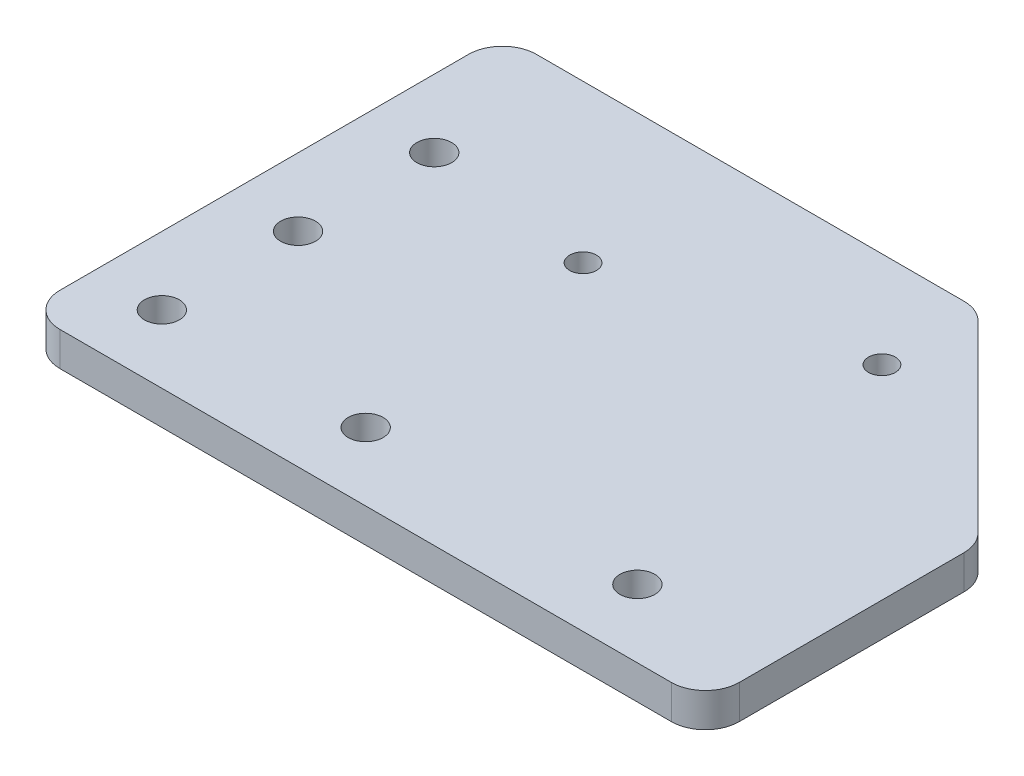
ISO-10303-21;
HEADER;
FILE_DESCRIPTION(('STEP AP214'),'2;1');
FILE_NAME('part.step','',(''),(''),'','','');
FILE_SCHEMA(('AUTOMOTIVE_DESIGN { 1 0 10303 214 1 1 1 1 }'));
ENDSEC;
DATA;
#1=APPLICATION_CONTEXT('core data for automotive mechanical design processes');
#2=APPLICATION_PROTOCOL_DEFINITION('international standard','automotive_design',2000,#1);
#3=PRODUCT_CONTEXT('',#1,'mechanical');
#4=PRODUCT('Part','Part','',(#3));
#5=PRODUCT_RELATED_PRODUCT_CATEGORY('part','',(#4));
#6=PRODUCT_DEFINITION_FORMATION('','',#4);
#7=PRODUCT_DEFINITION_CONTEXT('part definition',#1,'design');
#8=PRODUCT_DEFINITION('design','',#6,#7);
#9=PRODUCT_DEFINITION_SHAPE('','',#8);
#10=(LENGTH_UNIT() NAMED_UNIT(*) SI_UNIT(.MILLI.,.METRE.));
#11=(NAMED_UNIT(*) PLANE_ANGLE_UNIT() SI_UNIT($,.RADIAN.));
#12=(NAMED_UNIT(*) SI_UNIT($,.STERADIAN.) SOLID_ANGLE_UNIT());
#13=UNCERTAINTY_MEASURE_WITH_UNIT(LENGTH_MEASURE(1.E-05),#10,'distance_accuracy_value','');
#14=(GEOMETRIC_REPRESENTATION_CONTEXT(3) GLOBAL_UNCERTAINTY_ASSIGNED_CONTEXT((#13)) GLOBAL_UNIT_ASSIGNED_CONTEXT((#10,
#11,#12)) REPRESENTATION_CONTEXT('',''));
#15=CARTESIAN_POINT('',(0.,0.,0.));
#16=DIRECTION('',(0.,0.,1.));
#17=DIRECTION('',(1.,0.,0.));
#18=AXIS2_PLACEMENT_3D('',#15,#16,#17);
#19=CARTESIAN_POINT('',(-838.109743878933,19.0500000000059,838.109743878928));
#20=DIRECTION('',(0.707106781186549,0.,-0.707106781186545));
#21=DIRECTION('',(-0.707106781186545,0.,-0.70710678118655));
#22=AXIS2_PLACEMENT_3D('',#19,#20,#21);
#23=PLANE('',#22);
#24=DIRECTION('',(0.707106781186545,0.,0.70710678118655));
#25=VECTOR('',#24,1.);
#26=CARTESIAN_POINT('',(-838.109743878933,19.0500000000059,838.109743878928));
#27=LINE('',#26,#25);
#28=CARTESIAN_POINT('',(-836.340128060535,19.0500000000058,839.879359697327));
#29=VERTEX_POINT('',#28);
#30=CARTESIAN_POINT('',(-801.959718921586,19.0500000000056,874.259768836275));
#31=VERTEX_POINT('',#30);
#32=EDGE_CURVE('E222',#29,#31,#27,.T.);
#33=ORIENTED_EDGE('',*,*,#32,.T.);
#34=DIRECTION('',(0.,-1.,0.));
#35=VECTOR('',#34,1.);
#36=CARTESIAN_POINT('',(-801.959718921586,19.0500000000056,874.259768836275));
#37=LINE('',#36,#35);
#38=CARTESIAN_POINT('',(-801.959718921586,12.7000000000056,874.259768836275));
#39=VERTEX_POINT('',#38);
#40=EDGE_CURVE('E172',#31,#39,#37,.T.);
#41=ORIENTED_EDGE('',*,*,#40,.T.);
#42=DIRECTION('',(0.707106781186545,0.,0.70710678118655));
#43=VECTOR('',#42,1.);
#44=CARTESIAN_POINT('',(-838.109743878933,12.7000000000059,838.109743878928));
#45=LINE('',#44,#43);
#46=CARTESIAN_POINT('',(-836.340128060535,12.7000000000058,839.879359697327));
#47=VERTEX_POINT('',#46);
#48=EDGE_CURVE('E121',#47,#39,#45,.T.);
#49=ORIENTED_EDGE('',*,*,#48,.F.);
#50=DIRECTION('',(0.,-1.,0.));
#51=VECTOR('',#50,1.);
#52=CARTESIAN_POINT('',(-836.340128060535,19.0500000000058,839.879359697327));
#53=LINE('',#52,#51);
#54=EDGE_CURVE('E170',#47,#29,#53,.F.);
#55=ORIENTED_EDGE('',*,*,#54,.T.);
#56=EDGE_LOOP('',(#33,#41,#49,#55));
#57=FACE_BOUND('',#56,.T.);
#58=ADVANCED_FACE('F36',(#57),#23,.T.);
#59=CARTESIAN_POINT('',(1.11022302462516E-13,19.05,838.019487757861));
#60=DIRECTION('',(0.,0.,1.));
#61=DIRECTION('',(1.,0.,0.));
#62=AXIS2_PLACEMENT_3D('',#59,#60,#61);
#63=PLANE('',#62);
#64=DIRECTION('',(-1.,0.,0.));
#65=VECTOR('',#64,1.);
#66=CARTESIAN_POINT('',(1.11022302462516E-13,19.05,838.019487757861));
#67=LINE('',#66,#65);
#68=CARTESIAN_POINT('',(-840.830256121069,19.0500000000059,838.019487757861));
#69=VERTEX_POINT('',#68);
#70=CARTESIAN_POINT('',(-920.749846982121,19.0500000000064,838.019487757861));
#71=VERTEX_POINT('',#70);
#72=EDGE_CURVE('E142',#69,#71,#67,.T.);
#73=ORIENTED_EDGE('',*,*,#72,.F.);
#74=DIRECTION('',(0.,-1.,0.));
#75=VECTOR('',#74,1.);
#76=CARTESIAN_POINT('',(-840.830256121069,12.7000000000059,838.019487757861));
#77=LINE('',#76,#75);
#78=CARTESIAN_POINT('',(-840.830256121069,12.7000000000059,838.019487757861));
#79=VERTEX_POINT('',#78);
#80=EDGE_CURVE('E176',#69,#79,#77,.T.);
#81=ORIENTED_EDGE('',*,*,#80,.T.);
#82=DIRECTION('',(-1.,0.,0.));
#83=VECTOR('',#82,1.);
#84=CARTESIAN_POINT('',(1.11022302462516E-13,12.7,838.019487757861));
#85=LINE('',#84,#83);
#86=CARTESIAN_POINT('',(-920.749846982121,12.7000000000064,838.019487757861));
#87=VERTEX_POINT('',#86);
#88=EDGE_CURVE('E149',#79,#87,#85,.T.);
#89=ORIENTED_EDGE('',*,*,#88,.T.);
#90=DIRECTION('',(0.,-1.,0.));
#91=VECTOR('',#90,1.);
#92=CARTESIAN_POINT('',(-920.749846982121,19.0500000000064,838.019487757861));
#93=LINE('',#92,#91);
#94=EDGE_CURVE('E174',#87,#71,#93,.F.);
#95=ORIENTED_EDGE('',*,*,#94,.T.);
#96=EDGE_LOOP('',(#73,#81,#89,#95));
#97=FACE_BOUND('',#96,.T.);
#98=ADVANCED_FACE('F240',(#97),#63,.F.);
#99=CARTESIAN_POINT('',(-927.099846982121,19.0500000000065,0.));
#100=DIRECTION('',(1.,0.,0.));
#101=DIRECTION('',(0.,1.,0.));
#102=AXIS2_PLACEMENT_3D('',#99,#100,#101);
#103=PLANE('',#102);
#104=DIRECTION('',(0.,0.,1.));
#105=VECTOR('',#104,1.);
#106=CARTESIAN_POINT('',(-927.099846982121,19.0500000000065,0.));
#107=LINE('',#106,#105);
#108=CARTESIAN_POINT('',(-927.099846982121,19.0500000000065,844.369487757861));
#109=VERTEX_POINT('',#108);
#110=CARTESIAN_POINT('',(-927.099846982121,19.0500000000065,920.75));
#111=VERTEX_POINT('',#110);
#112=EDGE_CURVE('E146',#109,#111,#107,.T.);
#113=ORIENTED_EDGE('',*,*,#112,.F.);
#114=DIRECTION('',(0.,-1.,0.));
#115=VECTOR('',#114,1.);
#116=CARTESIAN_POINT('',(-927.099846982121,19.0500000000065,844.369487757861));
#117=LINE('',#116,#115);
#118=CARTESIAN_POINT('',(-927.099846982121,12.7000000000065,844.369487757861));
#119=VERTEX_POINT('',#118);
#120=EDGE_CURVE('E11',#109,#119,#117,.T.);
#121=ORIENTED_EDGE('',*,*,#120,.T.);
#122=DIRECTION('',(0.,0.,1.));
#123=VECTOR('',#122,1.);
#124=CARTESIAN_POINT('',(-927.099846982121,12.7000000000065,0.));
#125=LINE('',#124,#123);
#126=CARTESIAN_POINT('',(-927.099846982121,12.7000000000065,920.75));
#127=VERTEX_POINT('',#126);
#128=EDGE_CURVE('E233',#119,#127,#125,.T.);
#129=ORIENTED_EDGE('',*,*,#128,.T.);
#130=DIRECTION('',(0.,-1.,0.));
#131=VECTOR('',#130,1.);
#132=CARTESIAN_POINT('',(-927.099846982121,19.0500000000065,920.75));
#133=LINE('',#132,#131);
#134=EDGE_CURVE('E45',#127,#111,#133,.F.);
#135=ORIENTED_EDGE('',*,*,#134,.T.);
#136=EDGE_LOOP('',(#113,#121,#129,#135));
#137=FACE_BOUND('',#136,.T.);
#138=ADVANCED_FACE('F245',(#137),#103,.F.);
#139=CARTESIAN_POINT('',(-6.66133814775094E-13,19.05,927.100000000001));
#140=DIRECTION('',(0.,0.,-1.));
#141=DIRECTION('',(-1.,0.,0.));
#142=AXIS2_PLACEMENT_3D('',#139,#140,#141);
#143=PLANE('',#142);
#144=DIRECTION('',(1.,0.,0.));
#145=VECTOR('',#144,1.);
#146=CARTESIAN_POINT('',(-7.7715611723761E-13,12.7,927.100000000001));
#147=LINE('',#146,#145);
#148=CARTESIAN_POINT('',(-920.749846982121,12.7000000000064,927.1));
#149=VERTEX_POINT('',#148);
#150=CARTESIAN_POINT('',(-806.449846982121,12.7000000000056,927.1));
#151=VERTEX_POINT('',#150);
#152=EDGE_CURVE('E137',#149,#151,#147,.T.);
#153=ORIENTED_EDGE('',*,*,#152,.T.);
#154=DIRECTION('',(0.,-1.,0.));
#155=VECTOR('',#154,1.);
#156=CARTESIAN_POINT('',(-806.449846982121,19.0500000000056,927.1));
#157=LINE('',#156,#155);
#158=CARTESIAN_POINT('',(-806.449846982121,19.0500000000056,927.1));
#159=VERTEX_POINT('',#158);
#160=EDGE_CURVE('E160',#151,#159,#157,.F.);
#161=ORIENTED_EDGE('',*,*,#160,.T.);
#162=DIRECTION('',(1.,0.,0.));
#163=VECTOR('',#162,1.);
#164=CARTESIAN_POINT('',(-6.66133814775094E-13,19.05,927.100000000001));
#165=LINE('',#164,#163);
#166=CARTESIAN_POINT('',(-920.749846982121,19.0500000000064,927.1));
#167=VERTEX_POINT('',#166);
#168=EDGE_CURVE('E227',#167,#159,#165,.T.);
#169=ORIENTED_EDGE('',*,*,#168,.F.);
#170=DIRECTION('',(0.,-1.,0.));
#171=VECTOR('',#170,1.);
#172=CARTESIAN_POINT('',(-920.749846982121,19.0500000000064,927.1));
#173=LINE('',#172,#171);
#174=EDGE_CURVE('E157',#167,#149,#173,.T.);
#175=ORIENTED_EDGE('',*,*,#174,.T.);
#176=EDGE_LOOP('',(#153,#161,#169,#175));
#177=FACE_BOUND('',#176,.T.);
#178=ADVANCED_FACE('F252',(#177),#143,.F.);
#179=CARTESIAN_POINT('',(-800.099846982121,19.0500000000056,0.));
#180=DIRECTION('',(1.,0.,0.));
#181=DIRECTION('',(0.,1.,0.));
#182=AXIS2_PLACEMENT_3D('',#179,#180,#181);
#183=PLANE('',#182);
#184=DIRECTION('',(0.,0.,1.));
#185=VECTOR('',#184,1.);
#186=CARTESIAN_POINT('',(-800.099846982121,19.0500000000056,0.));
#187=LINE('',#186,#185);
#188=CARTESIAN_POINT('',(-800.099846982121,19.0500000000056,878.74989689681));
#189=VERTEX_POINT('',#188);
#190=CARTESIAN_POINT('',(-800.099846982121,19.0500000000056,920.75));
#191=VERTEX_POINT('',#190);
#192=EDGE_CURVE('E225',#189,#191,#187,.T.);
#193=ORIENTED_EDGE('',*,*,#192,.T.);
#194=DIRECTION('',(0.,-1.,0.));
#195=VECTOR('',#194,1.);
#196=CARTESIAN_POINT('',(-800.099846982121,12.7000000000056,920.75));
#197=LINE('',#196,#195);
#198=CARTESIAN_POINT('',(-800.099846982121,12.7000000000056,920.75));
#199=VERTEX_POINT('',#198);
#200=EDGE_CURVE('E136',#191,#199,#197,.T.);
#201=ORIENTED_EDGE('',*,*,#200,.T.);
#202=DIRECTION('',(0.,0.,1.));
#203=VECTOR('',#202,1.);
#204=CARTESIAN_POINT('',(-800.099846982121,12.7000000000056,0.));
#205=LINE('',#204,#203);
#206=CARTESIAN_POINT('',(-800.099846982121,12.7000000000056,878.74989689681));
#207=VERTEX_POINT('',#206);
#208=EDGE_CURVE('E119',#207,#199,#205,.T.);
#209=ORIENTED_EDGE('',*,*,#208,.F.);
#210=DIRECTION('',(0.,-1.,0.));
#211=VECTOR('',#210,1.);
#212=CARTESIAN_POINT('',(-800.099846982121,19.0500000000056,878.74989689681));
#213=LINE('',#212,#211);
#214=EDGE_CURVE('E133',#207,#189,#213,.F.);
#215=ORIENTED_EDGE('',*,*,#214,.T.);
#216=EDGE_LOOP('',(#193,#201,#209,#215));
#217=FACE_BOUND('',#216,.T.);
#218=ADVANCED_FACE('F132',(#217),#183,.T.);
#219=CARTESIAN_POINT('',(1.11022302462516E-13,19.05,0.));
#220=DIRECTION('',(0.,-1.,0.));
#221=DIRECTION('',(1.,0.,0.));
#222=AXIS2_PLACEMENT_3D('',#219,#220,#221);
#223=PLANE('',#222);
#224=CARTESIAN_POINT('',(-838.2,19.0500000000065,855.98));
#225=DIRECTION('',(0.,1.,0.));
#226=DIRECTION('',(0.,0.,1.));
#227=AXIS2_PLACEMENT_3D('',#224,#225,#226);
#228=CIRCLE('',#227,2.50000000000002);
#229=CARTESIAN_POINT('',(-838.2,19.0500000000065,858.48));
#230=VERTEX_POINT('',#229);
#231=EDGE_CURVE('E211',#230,#230,#228,.T.);
#232=ORIENTED_EDGE('',*,*,#231,.F.);
#233=EDGE_LOOP('',(#232));
#234=FACE_BOUND('',#233,.T.);
#235=CARTESIAN_POINT('',(-882.65,19.0500000000065,867.41));
#236=DIRECTION('',(0.,1.,0.));
#237=DIRECTION('',(0.,0.,1.));
#238=AXIS2_PLACEMENT_3D('',#235,#236,#237);
#239=CIRCLE('',#238,2.50000000000002);
#240=CARTESIAN_POINT('',(-882.65,19.0500000000065,869.91));
#241=VERTEX_POINT('',#240);
#242=EDGE_CURVE('E201',#241,#241,#239,.T.);
#243=ORIENTED_EDGE('',*,*,#242,.F.);
#244=EDGE_LOOP('',(#243));
#245=FACE_BOUND('',#244,.T.);
#246=CARTESIAN_POINT('',(-825.499846982121,19.0500000000065,914.4));
#247=DIRECTION('',(0.,1.,0.));
#248=DIRECTION('',(0.,0.,1.));
#249=AXIS2_PLACEMENT_3D('',#246,#247,#248);
#250=CIRCLE('',#249,3.26390000000001);
#251=CARTESIAN_POINT('',(-825.499846982121,19.0500000000065,917.6639));
#252=VERTEX_POINT('',#251);
#253=EDGE_CURVE('E198',#252,#252,#250,.T.);
#254=ORIENTED_EDGE('',*,*,#253,.F.);
#255=EDGE_LOOP('',(#254));
#256=FACE_BOUND('',#255,.T.);
#257=CARTESIAN_POINT('',(-876.300000000001,19.0500000000065,914.4));
#258=DIRECTION('',(0.,1.,0.));
#259=DIRECTION('',(0.,0.,1.));
#260=AXIS2_PLACEMENT_3D('',#257,#258,#259);
#261=CIRCLE('',#260,3.26390000000001);
#262=CARTESIAN_POINT('',(-876.300000000001,19.0500000000065,917.6639));
#263=VERTEX_POINT('',#262);
#264=EDGE_CURVE('E195',#263,#263,#261,.T.);
#265=ORIENTED_EDGE('',*,*,#264,.F.);
#266=EDGE_LOOP('',(#265));
#267=FACE_BOUND('',#266,.T.);
#268=CARTESIAN_POINT('',(-914.4,19.0500000000065,914.4));
#269=DIRECTION('',(0.,1.,0.));
#270=DIRECTION('',(0.,0.,1.));
#271=AXIS2_PLACEMENT_3D('',#268,#269,#270);
#272=CIRCLE('',#271,3.26390000000001);
#273=CARTESIAN_POINT('',(-914.4,19.0500000000065,917.6639));
#274=VERTEX_POINT('',#273);
#275=EDGE_CURVE('E191',#274,#274,#272,.T.);
#276=ORIENTED_EDGE('',*,*,#275,.F.);
#277=EDGE_LOOP('',(#276));
#278=FACE_BOUND('',#277,.T.);
#279=CARTESIAN_POINT('',(-914.4,19.0500000000065,888.93982925262));
#280=DIRECTION('',(0.,1.,0.));
#281=DIRECTION('',(0.,0.,1.));
#282=AXIS2_PLACEMENT_3D('',#279,#280,#281);
#283=CIRCLE('',#282,3.26390000000001);
#284=CARTESIAN_POINT('',(-914.4,19.0500000000065,892.203729252621));
#285=VERTEX_POINT('',#284);
#286=EDGE_CURVE('E187',#285,#285,#283,.T.);
#287=ORIENTED_EDGE('',*,*,#286,.F.);
#288=EDGE_LOOP('',(#287));
#289=FACE_BOUND('',#288,.T.);
#290=CARTESIAN_POINT('',(-914.4,19.0500000000065,863.479658505241));
#291=DIRECTION('',(0.,1.,0.));
#292=DIRECTION('',(0.,0.,1.));
#293=AXIS2_PLACEMENT_3D('',#290,#291,#292);
#294=CIRCLE('',#293,3.26390000000001);
#295=CARTESIAN_POINT('',(-914.4,19.0500000000065,866.743558505241));
#296=VERTEX_POINT('',#295);
#297=EDGE_CURVE('E183',#296,#296,#294,.T.);
#298=ORIENTED_EDGE('',*,*,#297,.F.);
#299=EDGE_LOOP('',(#298));
#300=FACE_BOUND('',#299,.T.);
#301=ORIENTED_EDGE('',*,*,#168,.T.);
#302=CARTESIAN_POINT('',(-806.449846982121,19.0500000000056,920.75));
#303=DIRECTION('',(0.,-1.,0.));
#304=DIRECTION('',(1.,0.,0.));
#305=AXIS2_PLACEMENT_3D('',#302,#303,#304);
#306=CIRCLE('',#305,6.35);
#307=EDGE_CURVE('E168',#159,#191,#306,.F.);
#308=ORIENTED_EDGE('',*,*,#307,.T.);
#309=ORIENTED_EDGE('',*,*,#192,.F.);
#310=CARTESIAN_POINT('',(-806.449846982121,19.0500000000056,878.74989689681));
#311=DIRECTION('',(0.,-1.,0.));
#312=DIRECTION('',(1.,0.,0.));
#313=AXIS2_PLACEMENT_3D('',#310,#311,#312);
#314=CIRCLE('',#313,6.35);
#315=EDGE_CURVE('E141',#189,#31,#314,.F.);
#316=ORIENTED_EDGE('',*,*,#315,.T.);
#317=ORIENTED_EDGE('',*,*,#32,.F.);
#318=CARTESIAN_POINT('',(-840.830256121069,19.0500000000059,844.369487757861));
#319=DIRECTION('',(0.,-1.,0.));
#320=DIRECTION('',(1.,0.,0.));
#321=AXIS2_PLACEMENT_3D('',#318,#319,#320);
#322=CIRCLE('',#321,6.35);
#323=EDGE_CURVE('E165',#29,#69,#322,.F.);
#324=ORIENTED_EDGE('',*,*,#323,.T.);
#325=ORIENTED_EDGE('',*,*,#72,.T.);
#326=CARTESIAN_POINT('',(-920.749846982121,19.0500000000064,844.369487757861));
#327=DIRECTION('',(0.,-1.,0.));
#328=DIRECTION('',(1.,0.,0.));
#329=AXIS2_PLACEMENT_3D('',#326,#327,#328);
#330=CIRCLE('',#329,6.35);
#331=EDGE_CURVE('E59',#71,#109,#330,.F.);
#332=ORIENTED_EDGE('',*,*,#331,.T.);
#333=ORIENTED_EDGE('',*,*,#112,.T.);
#334=CARTESIAN_POINT('',(-920.749846982121,19.0500000000064,920.75));
#335=DIRECTION('',(0.,-1.,0.));
#336=DIRECTION('',(1.,0.,0.));
#337=AXIS2_PLACEMENT_3D('',#334,#335,#336);
#338=CIRCLE('',#337,6.35);
#339=EDGE_CURVE('E162',#111,#167,#338,.F.);
#340=ORIENTED_EDGE('',*,*,#339,.T.);
#341=EDGE_LOOP('',(#301,#308,#309,#316,#317,#324,#325,#332,#333,#340));
#342=FACE_BOUND('',#341,.T.);
#343=ADVANCED_FACE('F255',(#234,#245,#256,#267,#278,#289,#300,#342),#223,.F.);
#344=CARTESIAN_POINT('',(1.11022302462516E-13,12.7,0.));
#345=DIRECTION('',(0.,-1.,0.));
#346=DIRECTION('',(1.,0.,0.));
#347=AXIS2_PLACEMENT_3D('',#344,#345,#346);
#348=PLANE('',#347);
#349=CARTESIAN_POINT('',(-838.2,12.7000000000059,855.98));
#350=DIRECTION('',(0.,-1.,0.));
#351=DIRECTION('',(1.,0.,0.));
#352=AXIS2_PLACEMENT_3D('',#349,#350,#351);
#353=CIRCLE('',#352,2.50000000000002);
#354=CARTESIAN_POINT('',(-835.7,12.7000000000058,855.98));
#355=VERTEX_POINT('',#354);
#356=EDGE_CURVE('E40',#355,#355,#353,.F.);
#357=ORIENTED_EDGE('',*,*,#356,.T.);
#358=EDGE_LOOP('',(#357));
#359=FACE_BOUND('',#358,.T.);
#360=CARTESIAN_POINT('',(-882.65,12.7000000000062,867.41));
#361=DIRECTION('',(0.,-1.,0.));
#362=DIRECTION('',(1.,0.,0.));
#363=AXIS2_PLACEMENT_3D('',#360,#361,#362);
#364=CIRCLE('',#363,2.50000000000002);
#365=CARTESIAN_POINT('',(-880.15,12.7000000000061,867.41));
#366=VERTEX_POINT('',#365);
#367=EDGE_CURVE('E199',#366,#366,#364,.F.);
#368=ORIENTED_EDGE('',*,*,#367,.T.);
#369=EDGE_LOOP('',(#368));
#370=FACE_BOUND('',#369,.T.);
#371=CARTESIAN_POINT('',(-825.499846982121,12.7000000000058,914.4));
#372=DIRECTION('',(0.,-1.,0.));
#373=DIRECTION('',(1.,0.,0.));
#374=AXIS2_PLACEMENT_3D('',#371,#372,#373);
#375=CIRCLE('',#374,3.26390000000001);
#376=CARTESIAN_POINT('',(-822.235946982121,12.7000000000057,914.4));
#377=VERTEX_POINT('',#376);
#378=EDGE_CURVE('E196',#377,#377,#375,.F.);
#379=ORIENTED_EDGE('',*,*,#378,.T.);
#380=EDGE_LOOP('',(#379));
#381=FACE_BOUND('',#380,.T.);
#382=CARTESIAN_POINT('',(-876.300000000001,12.7000000000061,914.4));
#383=DIRECTION('',(0.,-1.,0.));
#384=DIRECTION('',(1.,0.,0.));
#385=AXIS2_PLACEMENT_3D('',#382,#383,#384);
#386=CIRCLE('',#385,3.26390000000001);
#387=CARTESIAN_POINT('',(-873.036100000001,12.7000000000061,914.4));
#388=VERTEX_POINT('',#387);
#389=EDGE_CURVE('E192',#388,#388,#386,.F.);
#390=ORIENTED_EDGE('',*,*,#389,.T.);
#391=EDGE_LOOP('',(#390));
#392=FACE_BOUND('',#391,.T.);
#393=CARTESIAN_POINT('',(-914.4,12.7000000000064,914.4));
#394=DIRECTION('',(0.,-1.,0.));
#395=DIRECTION('',(1.,0.,0.));
#396=AXIS2_PLACEMENT_3D('',#393,#394,#395);
#397=CIRCLE('',#396,3.26390000000001);
#398=CARTESIAN_POINT('',(-911.1361,12.7000000000064,914.4));
#399=VERTEX_POINT('',#398);
#400=EDGE_CURVE('E188',#399,#399,#397,.F.);
#401=ORIENTED_EDGE('',*,*,#400,.T.);
#402=EDGE_LOOP('',(#401));
#403=FACE_BOUND('',#402,.T.);
#404=CARTESIAN_POINT('',(-914.4,12.7000000000064,888.93982925262));
#405=DIRECTION('',(0.,-1.,0.));
#406=DIRECTION('',(1.,0.,0.));
#407=AXIS2_PLACEMENT_3D('',#404,#405,#406);
#408=CIRCLE('',#407,3.26390000000001);
#409=CARTESIAN_POINT('',(-911.1361,12.7000000000064,888.93982925262));
#410=VERTEX_POINT('',#409);
#411=EDGE_CURVE('E184',#410,#410,#408,.F.);
#412=ORIENTED_EDGE('',*,*,#411,.T.);
#413=EDGE_LOOP('',(#412));
#414=FACE_BOUND('',#413,.T.);
#415=CARTESIAN_POINT('',(-914.4,12.7000000000064,863.479658505241));
#416=DIRECTION('',(0.,-1.,0.));
#417=DIRECTION('',(1.,0.,0.));
#418=AXIS2_PLACEMENT_3D('',#415,#416,#417);
#419=CIRCLE('',#418,3.26390000000001);
#420=CARTESIAN_POINT('',(-911.1361,12.7000000000064,863.479658505241));
#421=VERTEX_POINT('',#420);
#422=EDGE_CURVE('E180',#421,#421,#419,.F.);
#423=ORIENTED_EDGE('',*,*,#422,.T.);
#424=EDGE_LOOP('',(#423));
#425=FACE_BOUND('',#424,.T.);
#426=ORIENTED_EDGE('',*,*,#208,.T.);
#427=CARTESIAN_POINT('',(-806.449846982121,12.7000000000056,920.75));
#428=DIRECTION('',(0.,-1.,0.));
#429=DIRECTION('',(1.,0.,0.));
#430=AXIS2_PLACEMENT_3D('',#427,#428,#429);
#431=CIRCLE('',#430,6.35);
#432=EDGE_CURVE('E126',#199,#151,#431,.T.);
#433=ORIENTED_EDGE('',*,*,#432,.T.);
#434=ORIENTED_EDGE('',*,*,#152,.F.);
#435=CARTESIAN_POINT('',(-920.749846982121,12.7000000000064,920.75));
#436=DIRECTION('',(0.,-1.,0.));
#437=DIRECTION('',(1.,0.,0.));
#438=AXIS2_PLACEMENT_3D('',#435,#436,#437);
#439=CIRCLE('',#438,6.35);
#440=EDGE_CURVE('E144',#149,#127,#439,.T.);
#441=ORIENTED_EDGE('',*,*,#440,.T.);
#442=ORIENTED_EDGE('',*,*,#128,.F.);
#443=CARTESIAN_POINT('',(-920.749846982121,12.7000000000064,844.369487757861));
#444=DIRECTION('',(0.,-1.,0.));
#445=DIRECTION('',(1.,0.,0.));
#446=AXIS2_PLACEMENT_3D('',#443,#444,#445);
#447=CIRCLE('',#446,6.35);
#448=EDGE_CURVE('E153',#119,#87,#447,.T.);
#449=ORIENTED_EDGE('',*,*,#448,.T.);
#450=ORIENTED_EDGE('',*,*,#88,.F.);
#451=CARTESIAN_POINT('',(-840.830256121069,12.7000000000059,844.369487757861));
#452=DIRECTION('',(0.,-1.,0.));
#453=DIRECTION('',(1.,0.,0.));
#454=AXIS2_PLACEMENT_3D('',#451,#452,#453);
#455=CIRCLE('',#454,6.35);
#456=EDGE_CURVE('E127',#79,#47,#455,.T.);
#457=ORIENTED_EDGE('',*,*,#456,.T.);
#458=ORIENTED_EDGE('',*,*,#48,.T.);
#459=CARTESIAN_POINT('',(-806.449846982121,12.7000000000056,878.74989689681));
#460=DIRECTION('',(0.,-1.,0.));
#461=DIRECTION('',(1.,0.,0.));
#462=AXIS2_PLACEMENT_3D('',#459,#460,#461);
#463=CIRCLE('',#462,6.35);
#464=EDGE_CURVE('E116',#39,#207,#463,.T.);
#465=ORIENTED_EDGE('',*,*,#464,.T.);
#466=EDGE_LOOP('',(#426,#433,#434,#441,#442,#449,#450,#457,#458,#465));
#467=FACE_BOUND('',#466,.T.);
#468=ADVANCED_FACE('F118',(#359,#370,#381,#392,#403,#414,#425,#467),#348,.T.);
#469=CARTESIAN_POINT('',(-806.449846982121,19.0500000000056,920.75));
#470=DIRECTION('',(0.,1.,0.));
#471=DIRECTION('',(-1.,0.,0.));
#472=AXIS2_PLACEMENT_3D('',#469,#470,#471);
#473=CYLINDRICAL_SURFACE('',#472,6.35);
#474=ORIENTED_EDGE('',*,*,#307,.F.);
#475=ORIENTED_EDGE('',*,*,#160,.F.);
#476=ORIENTED_EDGE('',*,*,#432,.F.);
#477=ORIENTED_EDGE('',*,*,#200,.F.);
#478=EDGE_LOOP('',(#474,#475,#476,#477));
#479=FACE_BOUND('',#478,.T.);
#480=ADVANCED_FACE('F257',(#479),#473,.T.);
#481=CARTESIAN_POINT('',(-806.449846982121,19.0500000000056,878.74989689681));
#482=DIRECTION('',(0.,-1.,0.));
#483=DIRECTION('',(1.,0.,0.));
#484=AXIS2_PLACEMENT_3D('',#481,#482,#483);
#485=CYLINDRICAL_SURFACE('',#484,6.35);
#486=ORIENTED_EDGE('',*,*,#315,.F.);
#487=ORIENTED_EDGE('',*,*,#214,.F.);
#488=ORIENTED_EDGE('',*,*,#464,.F.);
#489=ORIENTED_EDGE('',*,*,#40,.F.);
#490=EDGE_LOOP('',(#486,#487,#488,#489));
#491=FACE_BOUND('',#490,.T.);
#492=ADVANCED_FACE('F140',(#491),#485,.T.);
#493=CARTESIAN_POINT('',(-840.830256121069,19.0500000000059,844.369487757861));
#494=DIRECTION('',(0.,1.,0.));
#495=DIRECTION('',(-1.,0.,0.));
#496=AXIS2_PLACEMENT_3D('',#493,#494,#495);
#497=CYLINDRICAL_SURFACE('',#496,6.35);
#498=ORIENTED_EDGE('',*,*,#323,.F.);
#499=ORIENTED_EDGE('',*,*,#54,.F.);
#500=ORIENTED_EDGE('',*,*,#456,.F.);
#501=ORIENTED_EDGE('',*,*,#80,.F.);
#502=EDGE_LOOP('',(#498,#499,#500,#501));
#503=FACE_BOUND('',#502,.T.);
#504=ADVANCED_FACE('F264',(#503),#497,.T.);
#505=CARTESIAN_POINT('',(-920.749846982121,19.0500000000064,844.369487757861));
#506=DIRECTION('',(0.,-1.,0.));
#507=DIRECTION('',(1.,0.,0.));
#508=AXIS2_PLACEMENT_3D('',#505,#506,#507);
#509=CYLINDRICAL_SURFACE('',#508,6.35);
#510=ORIENTED_EDGE('',*,*,#331,.F.);
#511=ORIENTED_EDGE('',*,*,#94,.F.);
#512=ORIENTED_EDGE('',*,*,#448,.F.);
#513=ORIENTED_EDGE('',*,*,#120,.F.);
#514=EDGE_LOOP('',(#510,#511,#512,#513));
#515=FACE_BOUND('',#514,.T.);
#516=ADVANCED_FACE('F243',(#515),#509,.T.);
#517=CARTESIAN_POINT('',(-920.749846982121,19.0500000000064,920.75));
#518=DIRECTION('',(0.,-1.,0.));
#519=DIRECTION('',(1.,0.,0.));
#520=AXIS2_PLACEMENT_3D('',#517,#518,#519);
#521=CYLINDRICAL_SURFACE('',#520,6.35);
#522=ORIENTED_EDGE('',*,*,#339,.F.);
#523=ORIENTED_EDGE('',*,*,#134,.F.);
#524=ORIENTED_EDGE('',*,*,#440,.F.);
#525=ORIENTED_EDGE('',*,*,#174,.F.);
#526=EDGE_LOOP('',(#522,#523,#524,#525));
#527=FACE_BOUND('',#526,.T.);
#528=ADVANCED_FACE('F38',(#527),#521,.T.);
#529=CARTESIAN_POINT('',(-914.4,19.0500000000065,863.479658505241));
#530=DIRECTION('',(0.,-1.,0.));
#531=DIRECTION('',(0.,0.,-1.));
#532=AXIS2_PLACEMENT_3D('',#529,#530,#531);
#533=CYLINDRICAL_SURFACE('',#532,3.26390000000001);
#534=ORIENTED_EDGE('',*,*,#422,.F.);
#535=EDGE_LOOP('',(#534));
#536=FACE_BOUND('',#535,.T.);
#537=ORIENTED_EDGE('',*,*,#297,.T.);
#538=EDGE_LOOP('',(#537));
#539=FACE_BOUND('',#538,.T.);
#540=ADVANCED_FACE('F285',(#536,#539),#533,.F.);
#541=CARTESIAN_POINT('',(-914.4,19.0500000000065,888.93982925262));
#542=DIRECTION('',(0.,-1.,0.));
#543=DIRECTION('',(0.,0.,-1.));
#544=AXIS2_PLACEMENT_3D('',#541,#542,#543);
#545=CYLINDRICAL_SURFACE('',#544,3.26390000000001);
#546=ORIENTED_EDGE('',*,*,#411,.F.);
#547=EDGE_LOOP('',(#546));
#548=FACE_BOUND('',#547,.T.);
#549=ORIENTED_EDGE('',*,*,#286,.T.);
#550=EDGE_LOOP('',(#549));
#551=FACE_BOUND('',#550,.T.);
#552=ADVANCED_FACE('F288',(#548,#551),#545,.F.);
#553=CARTESIAN_POINT('',(-914.4,19.0500000000065,914.4));
#554=DIRECTION('',(0.,-1.,0.));
#555=DIRECTION('',(0.,0.,-1.));
#556=AXIS2_PLACEMENT_3D('',#553,#554,#555);
#557=CYLINDRICAL_SURFACE('',#556,3.26390000000001);
#558=ORIENTED_EDGE('',*,*,#400,.F.);
#559=EDGE_LOOP('',(#558));
#560=FACE_BOUND('',#559,.T.);
#561=ORIENTED_EDGE('',*,*,#275,.T.);
#562=EDGE_LOOP('',(#561));
#563=FACE_BOUND('',#562,.T.);
#564=ADVANCED_FACE('F292',(#560,#563),#557,.F.);
#565=CARTESIAN_POINT('',(-876.300000000001,19.0500000000065,914.4));
#566=DIRECTION('',(0.,-1.,0.));
#567=DIRECTION('',(0.,0.,-1.));
#568=AXIS2_PLACEMENT_3D('',#565,#566,#567);
#569=CYLINDRICAL_SURFACE('',#568,3.26390000000001);
#570=ORIENTED_EDGE('',*,*,#389,.F.);
#571=EDGE_LOOP('',(#570));
#572=FACE_BOUND('',#571,.T.);
#573=ORIENTED_EDGE('',*,*,#264,.T.);
#574=EDGE_LOOP('',(#573));
#575=FACE_BOUND('',#574,.T.);
#576=ADVANCED_FACE('F296',(#572,#575),#569,.F.);
#577=CARTESIAN_POINT('',(-825.499846982121,19.0500000000065,914.4));
#578=DIRECTION('',(0.,-1.,0.));
#579=DIRECTION('',(0.,0.,-1.));
#580=AXIS2_PLACEMENT_3D('',#577,#578,#579);
#581=CYLINDRICAL_SURFACE('',#580,3.26390000000001);
#582=ORIENTED_EDGE('',*,*,#378,.F.);
#583=EDGE_LOOP('',(#582));
#584=FACE_BOUND('',#583,.T.);
#585=ORIENTED_EDGE('',*,*,#253,.T.);
#586=EDGE_LOOP('',(#585));
#587=FACE_BOUND('',#586,.T.);
#588=ADVANCED_FACE('F300',(#584,#587),#581,.F.);
#589=CARTESIAN_POINT('',(-882.65,19.0500000000065,867.41));
#590=DIRECTION('',(0.,-1.,0.));
#591=DIRECTION('',(0.,0.,-1.));
#592=AXIS2_PLACEMENT_3D('',#589,#590,#591);
#593=CYLINDRICAL_SURFACE('',#592,2.50000000000002);
#594=ORIENTED_EDGE('',*,*,#367,.F.);
#595=EDGE_LOOP('',(#594));
#596=FACE_BOUND('',#595,.T.);
#597=ORIENTED_EDGE('',*,*,#242,.T.);
#598=EDGE_LOOP('',(#597));
#599=FACE_BOUND('',#598,.T.);
#600=ADVANCED_FACE('F304',(#596,#599),#593,.F.);
#601=CARTESIAN_POINT('',(-838.2,19.0500000000065,855.98));
#602=DIRECTION('',(0.,-1.,0.));
#603=DIRECTION('',(0.,0.,-1.));
#604=AXIS2_PLACEMENT_3D('',#601,#602,#603);
#605=CYLINDRICAL_SURFACE('',#604,2.50000000000002);
#606=ORIENTED_EDGE('',*,*,#356,.F.);
#607=EDGE_LOOP('',(#606));
#608=FACE_BOUND('',#607,.T.);
#609=ORIENTED_EDGE('',*,*,#231,.T.);
#610=EDGE_LOOP('',(#609));
#611=FACE_BOUND('',#610,.T.);
#612=ADVANCED_FACE('F308',(#608,#611),#605,.F.);
#613=CLOSED_SHELL('',(#58,#98,#138,#178,#218,#343,#468,#480,#492,#504,#516,#528,#540,#552,#564,
#576,#588,#600,#612));
#614=MANIFOLD_SOLID_BREP('B2',#613);
#615=ADVANCED_BREP_SHAPE_REPRESENTATION('',(#18,#614),#14);
#616=SHAPE_DEFINITION_REPRESENTATION(#9,#615);
ENDSEC;
END-ISO-10303-21;
